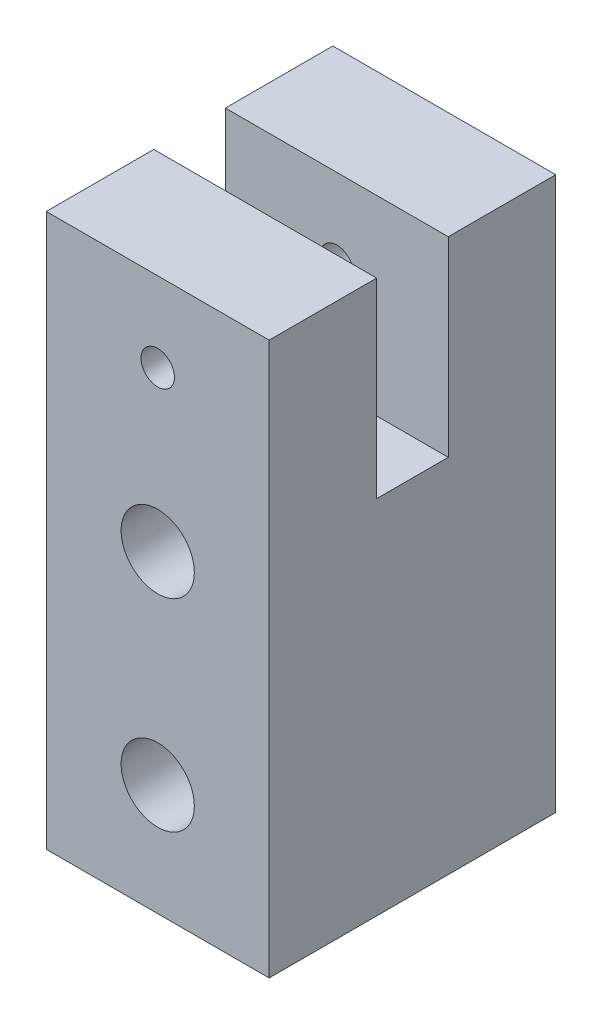
ISO-10303-21;
HEADER;
FILE_DESCRIPTION(('STEP AP214'),'2;1');
FILE_NAME('part.step','',(''),(''),'','','');
FILE_SCHEMA(('AUTOMOTIVE_DESIGN { 1 0 10303 214 1 1 1 1 }'));
ENDSEC;
DATA;
#1=APPLICATION_CONTEXT('core data for automotive mechanical design processes');
#2=APPLICATION_PROTOCOL_DEFINITION('international standard','automotive_design',2000,#1);
#3=PRODUCT_CONTEXT('',#1,'mechanical');
#4=PRODUCT('Part','Part','',(#3));
#5=PRODUCT_RELATED_PRODUCT_CATEGORY('part','',(#4));
#6=PRODUCT_DEFINITION_FORMATION('','',#4);
#7=PRODUCT_DEFINITION_CONTEXT('part definition',#1,'design');
#8=PRODUCT_DEFINITION('design','',#6,#7);
#9=PRODUCT_DEFINITION_SHAPE('','',#8);
#10=(LENGTH_UNIT() NAMED_UNIT(*) SI_UNIT(.MILLI.,.METRE.));
#11=(NAMED_UNIT(*) PLANE_ANGLE_UNIT() SI_UNIT($,.RADIAN.));
#12=(NAMED_UNIT(*) SI_UNIT($,.STERADIAN.) SOLID_ANGLE_UNIT());
#13=UNCERTAINTY_MEASURE_WITH_UNIT(LENGTH_MEASURE(1.E-05),#10,'distance_accuracy_value','');
#14=(GEOMETRIC_REPRESENTATION_CONTEXT(3) GLOBAL_UNCERTAINTY_ASSIGNED_CONTEXT((#13)) GLOBAL_UNIT_ASSIGNED_CONTEXT((#10,
#11,#12)) REPRESENTATION_CONTEXT('',''));
#15=CARTESIAN_POINT('',(0.,0.,0.));
#16=DIRECTION('',(0.,0.,1.));
#17=DIRECTION('',(1.,0.,0.));
#18=AXIS2_PLACEMENT_3D('',#15,#16,#17);
#19=CARTESIAN_POINT('',(-7.,17.35,18.));
#20=DIRECTION('',(0.,-1.,0.));
#21=DIRECTION('',(0.,0.,-1.));
#22=AXIS2_PLACEMENT_3D('',#19,#20,#21);
#23=PLANE('',#22);
#24=DIRECTION('',(0.,0.,-1.));
#25=VECTOR('',#24,1.);
#26=CARTESIAN_POINT('',(-7.,17.35,18.));
#27=LINE('',#26,#25);
#28=CARTESIAN_POINT('',(-7.,17.35,6.75));
#29=VERTEX_POINT('',#28);
#30=CARTESIAN_POINT('',(-7.,17.35,0.));
#31=VERTEX_POINT('',#30);
#32=EDGE_CURVE('E137',#29,#31,#27,.T.);
#33=ORIENTED_EDGE('',*,*,#32,.F.);
#34=DIRECTION('',(1.,0.,0.));
#35=VECTOR('',#34,1.);
#36=CARTESIAN_POINT('',(-0.999999999999999,17.35,6.75));
#37=LINE('',#36,#35);
#38=CARTESIAN_POINT('',(7.,17.35,6.75));
#39=VERTEX_POINT('',#38);
#40=EDGE_CURVE('E121',#29,#39,#37,.T.);
#41=ORIENTED_EDGE('',*,*,#40,.T.);
#42=DIRECTION('',(0.,0.,-1.));
#43=VECTOR('',#42,1.);
#44=CARTESIAN_POINT('',(7.,17.35,18.));
#45=LINE('',#44,#43);
#46=CARTESIAN_POINT('',(7.,17.35,0.));
#47=VERTEX_POINT('',#46);
#48=EDGE_CURVE('E44',#39,#47,#45,.T.);
#49=ORIENTED_EDGE('',*,*,#48,.T.);
#50=DIRECTION('',(-1.,0.,0.));
#51=VECTOR('',#50,1.);
#52=CARTESIAN_POINT('',(-7.,17.35,0.));
#53=LINE('',#52,#51);
#54=EDGE_CURVE('E145',#47,#31,#53,.T.);
#55=ORIENTED_EDGE('',*,*,#54,.T.);
#56=EDGE_LOOP('',(#33,#41,#49,#55));
#57=FACE_BOUND('',#56,.T.);
#58=ADVANCED_FACE('F35',(#57),#23,.F.);
#59=CARTESIAN_POINT('',(0.,12.35,0.));
#60=DIRECTION('',(0.,0.,1.));
#61=DIRECTION('',(1.,0.,0.));
#62=AXIS2_PLACEMENT_3D('',#59,#60,#61);
#63=CYLINDRICAL_SURFACE('',#62,1.05);
#64=CARTESIAN_POINT('',(0.,12.35,0.));
#65=DIRECTION('',(0.,0.,1.));
#66=DIRECTION('',(1.,0.,0.));
#67=AXIS2_PLACEMENT_3D('',#64,#65,#66);
#68=CIRCLE('',#67,1.05);
#69=CARTESIAN_POINT('',(1.05,12.35,0.));
#70=VERTEX_POINT('',#69);
#71=EDGE_CURVE('E202',#70,#70,#68,.T.);
#72=ORIENTED_EDGE('',*,*,#71,.F.);
#73=EDGE_LOOP('',(#72));
#74=FACE_BOUND('',#73,.T.);
#75=CARTESIAN_POINT('',(0.,12.35,6.75));
#76=DIRECTION('',(0.,0.,-1.));
#77=DIRECTION('',(0.,1.,0.));
#78=AXIS2_PLACEMENT_3D('',#75,#76,#77);
#79=CIRCLE('',#78,1.05);
#80=CARTESIAN_POINT('',(0.,13.4,6.75));
#81=VERTEX_POINT('',#80);
#82=EDGE_CURVE('E190',#81,#81,#79,.T.);
#83=ORIENTED_EDGE('',*,*,#82,.F.);
#84=EDGE_LOOP('',(#83));
#85=FACE_BOUND('',#84,.T.);
#86=ADVANCED_FACE('F255',(#74,#85),#63,.F.);
#87=CARTESIAN_POINT('',(-0.999999999999999,0.,0.));
#88=DIRECTION('',(-1.,0.,0.));
#89=DIRECTION('',(0.,0.,1.));
#90=AXIS2_PLACEMENT_3D('',#87,#88,#89);
#91=PLANE('',#90);
#92=DIRECTION('',(0.,1.,0.));
#93=VECTOR('',#92,1.);
#94=CARTESIAN_POINT('',(-0.999999999999999,5.35,6.75));
#95=LINE('',#94,#93);
#96=CARTESIAN_POINT('',(-0.999999999999999,5.35,6.75));
#97=VERTEX_POINT('',#96);
#98=CARTESIAN_POINT('',(-0.999999999999999,10.35,6.75));
#99=VERTEX_POINT('',#98);
#100=EDGE_CURVE('E186',#97,#99,#95,.T.);
#101=ORIENTED_EDGE('',*,*,#100,.T.);
#102=DIRECTION('',(0.,0.,1.));
#103=VECTOR('',#102,1.);
#104=CARTESIAN_POINT('',(-0.999999999999999,10.35,0.));
#105=LINE('',#104,#103);
#106=CARTESIAN_POINT('',(-0.999999999999999,10.35,11.25));
#107=VERTEX_POINT('',#106);
#108=EDGE_CURVE('E206',#99,#107,#105,.T.);
#109=ORIENTED_EDGE('',*,*,#108,.T.);
#110=DIRECTION('',(0.,-1.,0.));
#111=VECTOR('',#110,1.);
#112=CARTESIAN_POINT('',(-0.999999999999999,5.35,11.25));
#113=LINE('',#112,#111);
#114=CARTESIAN_POINT('',(-0.999999999999999,5.35,11.25));
#115=VERTEX_POINT('',#114);
#116=EDGE_CURVE('E193',#107,#115,#113,.T.);
#117=ORIENTED_EDGE('',*,*,#116,.T.);
#118=DIRECTION('',(0.,0.,-1.));
#119=VECTOR('',#118,1.);
#120=CARTESIAN_POINT('',(-0.999999999999999,5.35,11.25));
#121=LINE('',#120,#119);
#122=EDGE_CURVE('E134',#115,#97,#121,.T.);
#123=ORIENTED_EDGE('',*,*,#122,.T.);
#124=EDGE_LOOP('',(#101,#109,#117,#123));
#125=FACE_BOUND('',#124,.T.);
#126=ADVANCED_FACE('F228',(#125),#91,.F.);
#127=CARTESIAN_POINT('',(7.,-17.35,18.));
#128=DIRECTION('',(-1.,0.,0.));
#129=DIRECTION('',(0.,0.,1.));
#130=AXIS2_PLACEMENT_3D('',#127,#128,#129);
#131=PLANE('',#130);
#132=ORIENTED_EDGE('',*,*,#48,.F.);
#133=DIRECTION('',(0.,1.,0.));
#134=VECTOR('',#133,1.);
#135=CARTESIAN_POINT('',(7.,5.35,6.75));
#136=LINE('',#135,#134);
#137=CARTESIAN_POINT('',(7.,5.35,6.75));
#138=VERTEX_POINT('',#137);
#139=EDGE_CURVE('E129',#138,#39,#136,.T.);
#140=ORIENTED_EDGE('',*,*,#139,.F.);
#141=DIRECTION('',(0.,0.,-1.));
#142=VECTOR('',#141,1.);
#143=CARTESIAN_POINT('',(7.,5.35,11.25));
#144=LINE('',#143,#142);
#145=CARTESIAN_POINT('',(7.,5.35,11.25));
#146=VERTEX_POINT('',#145);
#147=EDGE_CURVE('E183',#146,#138,#144,.T.);
#148=ORIENTED_EDGE('',*,*,#147,.F.);
#149=DIRECTION('',(0.,-1.,0.));
#150=VECTOR('',#149,1.);
#151=CARTESIAN_POINT('',(7.,5.35,11.25));
#152=LINE('',#151,#150);
#153=CARTESIAN_POINT('',(7.,17.35,11.25));
#154=VERTEX_POINT('',#153);
#155=EDGE_CURVE('E187',#154,#146,#152,.T.);
#156=ORIENTED_EDGE('',*,*,#155,.F.);
#157=CARTESIAN_POINT('',(7.,17.35,18.));
#158=VERTEX_POINT('',#157);
#159=EDGE_CURVE('E11',#158,#154,#45,.T.);
#160=ORIENTED_EDGE('',*,*,#159,.F.);
#161=DIRECTION('',(0.,1.,0.));
#162=VECTOR('',#161,1.);
#163=CARTESIAN_POINT('',(7.,-17.35,18.));
#164=LINE('',#163,#162);
#165=CARTESIAN_POINT('',(7.,-17.35,18.));
#166=VERTEX_POINT('',#165);
#167=EDGE_CURVE('E154',#166,#158,#164,.T.);
#168=ORIENTED_EDGE('',*,*,#167,.F.);
#169=DIRECTION('',(0.,0.,-1.));
#170=VECTOR('',#169,1.);
#171=CARTESIAN_POINT('',(7.,-17.35,18.));
#172=LINE('',#171,#170);
#173=CARTESIAN_POINT('',(7.,-17.35,0.));
#174=VERTEX_POINT('',#173);
#175=EDGE_CURVE('E149',#166,#174,#172,.T.);
#176=ORIENTED_EDGE('',*,*,#175,.T.);
#177=DIRECTION('',(0.,1.,0.));
#178=VECTOR('',#177,1.);
#179=CARTESIAN_POINT('',(7.,-17.35,0.));
#180=LINE('',#179,#178);
#181=EDGE_CURVE('E157',#174,#47,#180,.T.);
#182=ORIENTED_EDGE('',*,*,#181,.T.);
#183=EDGE_LOOP('',(#132,#140,#148,#156,#160,#168,#176,#182));
#184=FACE_BOUND('',#183,.T.);
#185=ADVANCED_FACE('F37',(#184),#131,.F.);
#186=DIRECTION('',(1.,0.,0.));
#187=VECTOR('',#186,1.);
#188=CARTESIAN_POINT('',(-0.999999999999999,17.35,11.25));
#189=LINE('',#188,#187);
#190=CARTESIAN_POINT('',(-7.,17.35,11.25));
#191=VERTEX_POINT('',#190);
#192=EDGE_CURVE('E133',#191,#154,#189,.T.);
#193=ORIENTED_EDGE('',*,*,#192,.F.);
#194=CARTESIAN_POINT('',(-7.,17.35,18.));
#195=VERTEX_POINT('',#194);
#196=EDGE_CURVE('E146',#195,#191,#27,.T.);
#197=ORIENTED_EDGE('',*,*,#196,.F.);
#198=DIRECTION('',(-1.,0.,0.));
#199=VECTOR('',#198,1.);
#200=CARTESIAN_POINT('',(-7.,17.35,18.));
#201=LINE('',#200,#199);
#202=EDGE_CURVE('E82',#158,#195,#201,.T.);
#203=ORIENTED_EDGE('',*,*,#202,.F.);
#204=ORIENTED_EDGE('',*,*,#159,.T.);
#205=EDGE_LOOP('',(#193,#197,#203,#204));
#206=FACE_BOUND('',#205,.T.);
#207=ADVANCED_FACE('F256',(#206),#23,.F.);
#208=CARTESIAN_POINT('',(-7.,-17.35,18.));
#209=DIRECTION('',(1.,0.,0.));
#210=DIRECTION('',(0.,0.,-1.));
#211=AXIS2_PLACEMENT_3D('',#208,#209,#210);
#212=PLANE('',#211);
#213=DIRECTION('',(0.,0.,-1.));
#214=VECTOR('',#213,1.);
#215=CARTESIAN_POINT('',(-7.,10.35,6.75));
#216=LINE('',#215,#214);
#217=CARTESIAN_POINT('',(-7.,10.35,11.25));
#218=VERTEX_POINT('',#217);
#219=CARTESIAN_POINT('',(-7.,10.35,6.75));
#220=VERTEX_POINT('',#219);
#221=EDGE_CURVE('E141',#218,#220,#216,.T.);
#222=ORIENTED_EDGE('',*,*,#221,.T.);
#223=DIRECTION('',(0.,1.,0.));
#224=VECTOR('',#223,1.);
#225=CARTESIAN_POINT('',(-7.,17.35,6.75));
#226=LINE('',#225,#224);
#227=EDGE_CURVE('E126',#220,#29,#226,.T.);
#228=ORIENTED_EDGE('',*,*,#227,.T.);
#229=ORIENTED_EDGE('',*,*,#32,.T.);
#230=DIRECTION('',(0.,-1.,0.));
#231=VECTOR('',#230,1.);
#232=CARTESIAN_POINT('',(-7.,-17.35,0.));
#233=LINE('',#232,#231);
#234=CARTESIAN_POINT('',(-7.,-17.35,0.));
#235=VERTEX_POINT('',#234);
#236=EDGE_CURVE('E69',#31,#235,#233,.T.);
#237=ORIENTED_EDGE('',*,*,#236,.T.);
#238=DIRECTION('',(0.,0.,-1.));
#239=VECTOR('',#238,1.);
#240=CARTESIAN_POINT('',(-7.,-17.35,18.));
#241=LINE('',#240,#239);
#242=CARTESIAN_POINT('',(-7.,-17.35,18.));
#243=VERTEX_POINT('',#242);
#244=EDGE_CURVE('E147',#243,#235,#241,.T.);
#245=ORIENTED_EDGE('',*,*,#244,.F.);
#246=DIRECTION('',(0.,-1.,0.));
#247=VECTOR('',#246,1.);
#248=CARTESIAN_POINT('',(-7.,-17.35,18.));
#249=LINE('',#248,#247);
#250=EDGE_CURVE('E162',#195,#243,#249,.T.);
#251=ORIENTED_EDGE('',*,*,#250,.F.);
#252=ORIENTED_EDGE('',*,*,#196,.T.);
#253=DIRECTION('',(0.,-1.,0.));
#254=VECTOR('',#253,1.);
#255=CARTESIAN_POINT('',(-7.,17.35,11.25));
#256=LINE('',#255,#254);
#257=EDGE_CURVE('E142',#191,#218,#256,.T.);
#258=ORIENTED_EDGE('',*,*,#257,.T.);
#259=EDGE_LOOP('',(#222,#228,#229,#237,#245,#251,#252,#258));
#260=FACE_BOUND('',#259,.T.);
#261=ADVANCED_FACE('F136',(#260),#212,.F.);
#262=CARTESIAN_POINT('',(-7.,-17.35,18.));
#263=DIRECTION('',(0.,1.,0.));
#264=DIRECTION('',(0.,0.,1.));
#265=AXIS2_PLACEMENT_3D('',#262,#263,#264);
#266=PLANE('',#265);
#267=DIRECTION('',(1.,0.,0.));
#268=VECTOR('',#267,1.);
#269=CARTESIAN_POINT('',(-7.,-17.35,0.));
#270=LINE('',#269,#268);
#271=EDGE_CURVE('E75',#235,#174,#270,.T.);
#272=ORIENTED_EDGE('',*,*,#271,.T.);
#273=ORIENTED_EDGE('',*,*,#175,.F.);
#274=DIRECTION('',(1.,0.,0.));
#275=VECTOR('',#274,1.);
#276=CARTESIAN_POINT('',(-7.,-17.35,18.));
#277=LINE('',#276,#275);
#278=EDGE_CURVE('E52',#243,#166,#277,.T.);
#279=ORIENTED_EDGE('',*,*,#278,.F.);
#280=ORIENTED_EDGE('',*,*,#244,.T.);
#281=EDGE_LOOP('',(#272,#273,#279,#280));
#282=FACE_BOUND('',#281,.T.);
#283=ADVANCED_FACE('F249',(#282),#266,.F.);
#284=CARTESIAN_POINT('',(0.,0.,18.));
#285=DIRECTION('',(0.,0.,-1.));
#286=DIRECTION('',(-1.,0.,0.));
#287=AXIS2_PLACEMENT_3D('',#284,#285,#286);
#288=PLANE('',#287);
#289=CARTESIAN_POINT('',(0.,12.35,18.));
#290=DIRECTION('',(0.,0.,1.));
#291=DIRECTION('',(1.,0.,0.));
#292=AXIS2_PLACEMENT_3D('',#289,#290,#291);
#293=CIRCLE('',#292,1.05);
#294=CARTESIAN_POINT('',(1.05,12.35,18.));
#295=VERTEX_POINT('',#294);
#296=EDGE_CURVE('E203',#295,#295,#293,.T.);
#297=ORIENTED_EDGE('',*,*,#296,.F.);
#298=EDGE_LOOP('',(#297));
#299=FACE_BOUND('',#298,.T.);
#300=CARTESIAN_POINT('',(0.,2.34999999999999,18.));
#301=DIRECTION('',(0.,0.,1.));
#302=DIRECTION('',(1.,0.,0.));
#303=AXIS2_PLACEMENT_3D('',#300,#301,#302);
#304=CIRCLE('',#303,2.3);
#305=CARTESIAN_POINT('',(2.3,2.34999999999999,18.));
#306=VERTEX_POINT('',#305);
#307=EDGE_CURVE('E172',#306,#306,#304,.T.);
#308=ORIENTED_EDGE('',*,*,#307,.F.);
#309=EDGE_LOOP('',(#308));
#310=FACE_BOUND('',#309,.T.);
#311=CARTESIAN_POINT('',(0.,-10.35,18.));
#312=DIRECTION('',(0.,0.,1.));
#313=DIRECTION('',(1.,0.,0.));
#314=AXIS2_PLACEMENT_3D('',#311,#312,#313);
#315=CIRCLE('',#314,2.3);
#316=CARTESIAN_POINT('',(2.3,-10.35,18.));
#317=VERTEX_POINT('',#316);
#318=EDGE_CURVE('E166',#317,#317,#315,.T.);
#319=ORIENTED_EDGE('',*,*,#318,.F.);
#320=EDGE_LOOP('',(#319));
#321=FACE_BOUND('',#320,.T.);
#322=ORIENTED_EDGE('',*,*,#167,.T.);
#323=ORIENTED_EDGE('',*,*,#202,.T.);
#324=ORIENTED_EDGE('',*,*,#250,.T.);
#325=ORIENTED_EDGE('',*,*,#278,.T.);
#326=EDGE_LOOP('',(#322,#323,#324,#325));
#327=FACE_BOUND('',#326,.T.);
#328=ADVANCED_FACE('F239',(#299,#310,#321,#327),#288,.F.);
#329=CARTESIAN_POINT('',(0.,0.,0.));
#330=DIRECTION('',(0.,0.,-1.));
#331=DIRECTION('',(-1.,0.,0.));
#332=AXIS2_PLACEMENT_3D('',#329,#330,#331);
#333=PLANE('',#332);
#334=ORIENTED_EDGE('',*,*,#71,.T.);
#335=EDGE_LOOP('',(#334));
#336=FACE_BOUND('',#335,.T.);
#337=CARTESIAN_POINT('',(0.,2.34999999999999,0.));
#338=DIRECTION('',(0.,0.,1.));
#339=DIRECTION('',(1.,0.,0.));
#340=AXIS2_PLACEMENT_3D('',#337,#338,#339);
#341=CIRCLE('',#340,2.3);
#342=CARTESIAN_POINT('',(2.3,2.34999999999999,0.));
#343=VERTEX_POINT('',#342);
#344=EDGE_CURVE('E169',#343,#343,#341,.T.);
#345=ORIENTED_EDGE('',*,*,#344,.T.);
#346=EDGE_LOOP('',(#345));
#347=FACE_BOUND('',#346,.T.);
#348=CARTESIAN_POINT('',(0.,-10.35,0.));
#349=DIRECTION('',(0.,0.,1.));
#350=DIRECTION('',(1.,0.,0.));
#351=AXIS2_PLACEMENT_3D('',#348,#349,#350);
#352=CIRCLE('',#351,2.3);
#353=CARTESIAN_POINT('',(2.3,-10.35,0.));
#354=VERTEX_POINT('',#353);
#355=EDGE_CURVE('E160',#354,#354,#352,.T.);
#356=ORIENTED_EDGE('',*,*,#355,.T.);
#357=EDGE_LOOP('',(#356));
#358=FACE_BOUND('',#357,.T.);
#359=ORIENTED_EDGE('',*,*,#181,.F.);
#360=ORIENTED_EDGE('',*,*,#271,.F.);
#361=ORIENTED_EDGE('',*,*,#236,.F.);
#362=ORIENTED_EDGE('',*,*,#54,.F.);
#363=EDGE_LOOP('',(#359,#360,#361,#362));
#364=FACE_BOUND('',#363,.T.);
#365=ADVANCED_FACE('F236',(#336,#347,#358,#364),#333,.T.);
#366=CARTESIAN_POINT('',(0.,-10.35,0.));
#367=DIRECTION('',(0.,0.,1.));
#368=DIRECTION('',(1.,0.,0.));
#369=AXIS2_PLACEMENT_3D('',#366,#367,#368);
#370=CYLINDRICAL_SURFACE('',#369,2.3);
#371=ORIENTED_EDGE('',*,*,#355,.F.);
#372=EDGE_LOOP('',(#371));
#373=FACE_BOUND('',#372,.T.);
#374=ORIENTED_EDGE('',*,*,#318,.T.);
#375=EDGE_LOOP('',(#374));
#376=FACE_BOUND('',#375,.T.);
#377=ADVANCED_FACE('F238',(#373,#376),#370,.F.);
#378=CARTESIAN_POINT('',(0.,2.34999999999999,0.));
#379=DIRECTION('',(0.,0.,1.));
#380=DIRECTION('',(1.,0.,0.));
#381=AXIS2_PLACEMENT_3D('',#378,#379,#380);
#382=CYLINDRICAL_SURFACE('',#381,2.3);
#383=ORIENTED_EDGE('',*,*,#344,.F.);
#384=EDGE_LOOP('',(#383));
#385=FACE_BOUND('',#384,.T.);
#386=ORIENTED_EDGE('',*,*,#307,.T.);
#387=EDGE_LOOP('',(#386));
#388=FACE_BOUND('',#387,.T.);
#389=ADVANCED_FACE('F246',(#385,#388),#382,.F.);
#390=CARTESIAN_POINT('',(-0.999999999999999,5.35,6.75));
#391=DIRECTION('',(0.,0.,-1.));
#392=DIRECTION('',(0.,1.,0.));
#393=AXIS2_PLACEMENT_3D('',#390,#391,#392);
#394=PLANE('',#393);
#395=DIRECTION('',(1.,0.,0.));
#396=VECTOR('',#395,1.);
#397=CARTESIAN_POINT('',(-7.,10.35,6.75));
#398=LINE('',#397,#396);
#399=EDGE_CURVE('E211',#220,#99,#398,.T.);
#400=ORIENTED_EDGE('',*,*,#399,.T.);
#401=ORIENTED_EDGE('',*,*,#100,.F.);
#402=DIRECTION('',(1.,0.,0.));
#403=VECTOR('',#402,1.);
#404=CARTESIAN_POINT('',(-0.999999999999999,5.35,6.75));
#405=LINE('',#404,#403);
#406=EDGE_CURVE('E175',#97,#138,#405,.T.);
#407=ORIENTED_EDGE('',*,*,#406,.T.);
#408=ORIENTED_EDGE('',*,*,#139,.T.);
#409=ORIENTED_EDGE('',*,*,#40,.F.);
#410=ORIENTED_EDGE('',*,*,#227,.F.);
#411=EDGE_LOOP('',(#400,#401,#407,#408,#409,#410));
#412=FACE_BOUND('',#411,.T.);
#413=ORIENTED_EDGE('',*,*,#82,.T.);
#414=EDGE_LOOP('',(#413));
#415=FACE_BOUND('',#414,.T.);
#416=ADVANCED_FACE('F124',(#412,#415),#394,.F.);
#417=CARTESIAN_POINT('',(-0.999999999999999,5.35,11.25));
#418=DIRECTION('',(0.,-1.,0.));
#419=DIRECTION('',(0.,0.,-1.));
#420=AXIS2_PLACEMENT_3D('',#417,#418,#419);
#421=PLANE('',#420);
#422=ORIENTED_EDGE('',*,*,#147,.T.);
#423=ORIENTED_EDGE('',*,*,#406,.F.);
#424=ORIENTED_EDGE('',*,*,#122,.F.);
#425=DIRECTION('',(1.,0.,0.));
#426=VECTOR('',#425,1.);
#427=CARTESIAN_POINT('',(-0.999999999999999,5.35,11.25));
#428=LINE('',#427,#426);
#429=EDGE_CURVE('E179',#115,#146,#428,.T.);
#430=ORIENTED_EDGE('',*,*,#429,.T.);
#431=EDGE_LOOP('',(#422,#423,#424,#430));
#432=FACE_BOUND('',#431,.T.);
#433=ADVANCED_FACE('F231',(#432),#421,.F.);
#434=CARTESIAN_POINT('',(-0.999999999999999,5.35,11.25));
#435=DIRECTION('',(0.,0.,1.));
#436=DIRECTION('',(1.,0.,0.));
#437=AXIS2_PLACEMENT_3D('',#434,#435,#436);
#438=PLANE('',#437);
#439=ORIENTED_EDGE('',*,*,#116,.F.);
#440=DIRECTION('',(1.,0.,0.));
#441=VECTOR('',#440,1.);
#442=CARTESIAN_POINT('',(-7.,10.35,11.25));
#443=LINE('',#442,#441);
#444=EDGE_CURVE('E212',#218,#107,#443,.T.);
#445=ORIENTED_EDGE('',*,*,#444,.F.);
#446=ORIENTED_EDGE('',*,*,#257,.F.);
#447=ORIENTED_EDGE('',*,*,#192,.T.);
#448=ORIENTED_EDGE('',*,*,#155,.T.);
#449=ORIENTED_EDGE('',*,*,#429,.F.);
#450=EDGE_LOOP('',(#439,#445,#446,#447,#448,#449));
#451=FACE_BOUND('',#450,.T.);
#452=CARTESIAN_POINT('',(0.,12.35,11.25));
#453=DIRECTION('',(0.,0.,1.));
#454=DIRECTION('',(1.,0.,0.));
#455=AXIS2_PLACEMENT_3D('',#452,#453,#454);
#456=CIRCLE('',#455,1.05);
#457=CARTESIAN_POINT('',(1.05,12.35,11.25));
#458=VERTEX_POINT('',#457);
#459=EDGE_CURVE('E199',#458,#458,#456,.T.);
#460=ORIENTED_EDGE('',*,*,#459,.T.);
#461=EDGE_LOOP('',(#460));
#462=FACE_BOUND('',#461,.T.);
#463=ADVANCED_FACE('F220',(#451,#462),#438,.F.);
#464=ORIENTED_EDGE('',*,*,#296,.T.);
#465=EDGE_LOOP('',(#464));
#466=FACE_BOUND('',#465,.T.);
#467=ORIENTED_EDGE('',*,*,#459,.F.);
#468=EDGE_LOOP('',(#467));
#469=FACE_BOUND('',#468,.T.);
#470=ADVANCED_FACE('F262',(#466,#469),#63,.F.);
#471=CARTESIAN_POINT('',(-7.,10.35,6.75));
#472=DIRECTION('',(0.,-1.,0.));
#473=DIRECTION('',(0.,0.,-1.));
#474=AXIS2_PLACEMENT_3D('',#471,#472,#473);
#475=PLANE('',#474);
#476=ORIENTED_EDGE('',*,*,#399,.F.);
#477=ORIENTED_EDGE('',*,*,#221,.F.);
#478=ORIENTED_EDGE('',*,*,#444,.T.);
#479=ORIENTED_EDGE('',*,*,#108,.F.);
#480=EDGE_LOOP('',(#476,#477,#478,#479));
#481=FACE_BOUND('',#480,.T.);
#482=ADVANCED_FACE('F225',(#481),#475,.F.);
#483=CLOSED_SHELL('',(#58,#86,#126,#185,#207,#261,#283,#328,#365,#377,#389,#416,#433,#463,#470,#482));
#484=MANIFOLD_SOLID_BREP('B2',#483);
#485=ADVANCED_BREP_SHAPE_REPRESENTATION('',(#18,#484),#14);
#486=SHAPE_DEFINITION_REPRESENTATION(#9,#485);
ENDSEC;
END-ISO-10303-21;
